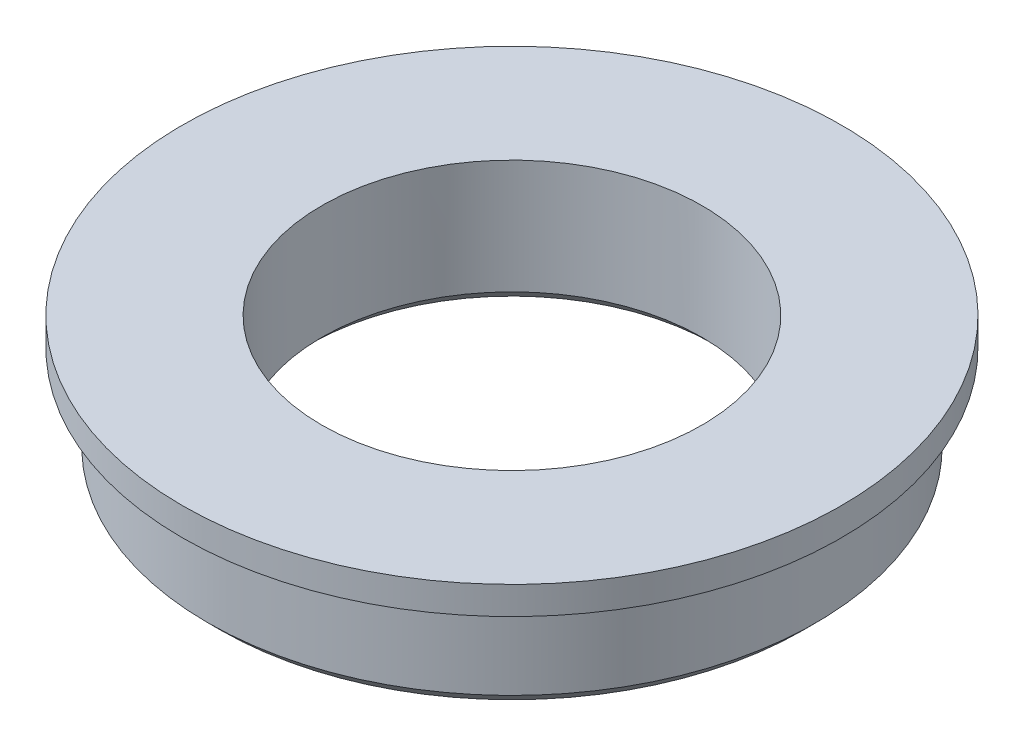
ISO-10303-21;
HEADER;
FILE_DESCRIPTION(('STEP AP214'),'2;1');
FILE_NAME('part.step','',(''),(''),'','','');
FILE_SCHEMA(('AUTOMOTIVE_DESIGN { 1 0 10303 214 1 1 1 1 }'));
ENDSEC;
DATA;
#1=APPLICATION_CONTEXT('core data for automotive mechanical design processes');
#2=APPLICATION_PROTOCOL_DEFINITION('international standard','automotive_design',2000,#1);
#3=PRODUCT_CONTEXT('',#1,'mechanical');
#4=PRODUCT('Part','Part','',(#3));
#5=PRODUCT_RELATED_PRODUCT_CATEGORY('part','',(#4));
#6=PRODUCT_DEFINITION_FORMATION('','',#4);
#7=PRODUCT_DEFINITION_CONTEXT('part definition',#1,'design');
#8=PRODUCT_DEFINITION('design','',#6,#7);
#9=PRODUCT_DEFINITION_SHAPE('','',#8);
#10=(LENGTH_UNIT() NAMED_UNIT(*) SI_UNIT(.MILLI.,.METRE.));
#11=(NAMED_UNIT(*) PLANE_ANGLE_UNIT() SI_UNIT($,.RADIAN.));
#12=(NAMED_UNIT(*) SI_UNIT($,.STERADIAN.) SOLID_ANGLE_UNIT());
#13=UNCERTAINTY_MEASURE_WITH_UNIT(LENGTH_MEASURE(1.E-05),#10,'distance_accuracy_value','');
#14=(GEOMETRIC_REPRESENTATION_CONTEXT(3) GLOBAL_UNCERTAINTY_ASSIGNED_CONTEXT((#13)) GLOBAL_UNIT_ASSIGNED_CONTEXT((#10,
#11,#12)) REPRESENTATION_CONTEXT('',''));
#15=CARTESIAN_POINT('',(0.,0.,0.));
#16=DIRECTION('',(0.,0.,1.));
#17=DIRECTION('',(1.,0.,0.));
#18=AXIS2_PLACEMENT_3D('',#15,#16,#17);
#19=CARTESIAN_POINT('',(0.,22.088288083813,0.));
#20=DIRECTION('',(0.,1.,0.));
#21=DIRECTION('',(0.,0.,1.));
#22=AXIS2_PLACEMENT_3D('',#19,#20,#21);
#23=CYLINDRICAL_SURFACE('',#22,7.5);
#24=CARTESIAN_POINT('',(0.,0.500000000000004,0.));
#25=DIRECTION('',(0.,-1.,0.));
#26=DIRECTION('',(0.,0.,-1.));
#27=AXIS2_PLACEMENT_3D('',#24,#25,#26);
#28=CIRCLE('',#27,7.5);
#29=CARTESIAN_POINT('',(0.,0.500000000000004,-7.5));
#30=VERTEX_POINT('',#29);
#31=EDGE_CURVE('E40',#30,#30,#28,.T.);
#32=ORIENTED_EDGE('',*,*,#31,.T.);
#33=EDGE_LOOP('',(#32));
#34=FACE_BOUND('',#33,.T.);
#35=CARTESIAN_POINT('',(0.,5.,0.));
#36=DIRECTION('',(0.,1.,0.));
#37=DIRECTION('',(0.,0.,1.));
#38=AXIS2_PLACEMENT_3D('',#35,#36,#37);
#39=CIRCLE('',#38,7.5);
#40=CARTESIAN_POINT('',(0.,5.,7.5));
#41=VERTEX_POINT('',#40);
#42=EDGE_CURVE('E62',#41,#41,#39,.T.);
#43=ORIENTED_EDGE('',*,*,#42,.T.);
#44=EDGE_LOOP('',(#43));
#45=FACE_BOUND('',#44,.T.);
#46=ADVANCED_FACE('F33',(#34,#45),#23,.F.);
#47=CARTESIAN_POINT('',(-7.5,0.,0.));
#48=DIRECTION('',(0.,-1.,0.));
#49=DIRECTION('',(0.,0.,-1.));
#50=AXIS2_PLACEMENT_3D('',#47,#48,#49);
#51=PLANE('',#50);
#52=CARTESIAN_POINT('',(0.,0.,0.));
#53=DIRECTION('',(0.,-1.,0.));
#54=DIRECTION('',(0.,0.,-1.));
#55=AXIS2_PLACEMENT_3D('',#52,#53,#54);
#56=CIRCLE('',#55,8.);
#57=CARTESIAN_POINT('',(0.,0.,-8.));
#58=VERTEX_POINT('',#57);
#59=EDGE_CURVE('E44',#58,#58,#56,.F.);
#60=ORIENTED_EDGE('',*,*,#59,.T.);
#61=EDGE_LOOP('',(#60));
#62=FACE_BOUND('',#61,.T.);
#63=CARTESIAN_POINT('',(0.,0.,0.));
#64=DIRECTION('',(0.,-1.,0.));
#65=DIRECTION('',(0.,0.,-1.));
#66=AXIS2_PLACEMENT_3D('',#63,#64,#65);
#67=CIRCLE('',#66,11.5);
#68=CARTESIAN_POINT('',(0.,0.,-11.5));
#69=VERTEX_POINT('',#68);
#70=EDGE_CURVE('E48',#69,#69,#67,.T.);
#71=ORIENTED_EDGE('',*,*,#70,.T.);
#72=EDGE_LOOP('',(#71));
#73=FACE_BOUND('',#72,.T.);
#74=ADVANCED_FACE('F82',(#62,#73),#51,.T.);
#75=CARTESIAN_POINT('',(0.,22.088288083813,0.));
#76=DIRECTION('',(0.,1.,0.));
#77=DIRECTION('',(0.,0.,1.));
#78=AXIS2_PLACEMENT_3D('',#75,#76,#77);
#79=CYLINDRICAL_SURFACE('',#78,12.);
#80=CARTESIAN_POINT('',(0.,0.500000000000004,0.));
#81=DIRECTION('',(0.,-1.,0.));
#82=DIRECTION('',(0.,0.,-1.));
#83=AXIS2_PLACEMENT_3D('',#80,#81,#82);
#84=CIRCLE('',#83,12.);
#85=CARTESIAN_POINT('',(0.,0.500000000000004,-12.));
#86=VERTEX_POINT('',#85);
#87=EDGE_CURVE('E10',#86,#86,#84,.F.);
#88=ORIENTED_EDGE('',*,*,#87,.T.);
#89=EDGE_LOOP('',(#88));
#90=FACE_BOUND('',#89,.T.);
#91=CARTESIAN_POINT('',(0.,3.9,0.));
#92=DIRECTION('',(0.,1.,0.));
#93=DIRECTION('',(0.,0.,1.));
#94=AXIS2_PLACEMENT_3D('',#91,#92,#93);
#95=CIRCLE('',#94,12.);
#96=CARTESIAN_POINT('',(0.,3.9,12.));
#97=VERTEX_POINT('',#96);
#98=EDGE_CURVE('E53',#97,#97,#95,.T.);
#99=ORIENTED_EDGE('',*,*,#98,.F.);
#100=EDGE_LOOP('',(#99));
#101=FACE_BOUND('',#100,.T.);
#102=ADVANCED_FACE('F87',(#90,#101),#79,.T.);
#103=CARTESIAN_POINT('',(-12.,3.9,0.));
#104=DIRECTION('',(0.,-1.,0.));
#105=DIRECTION('',(0.,0.,-1.));
#106=AXIS2_PLACEMENT_3D('',#103,#104,#105);
#107=PLANE('',#106);
#108=ORIENTED_EDGE('',*,*,#98,.T.);
#109=EDGE_LOOP('',(#108));
#110=FACE_BOUND('',#109,.T.);
#111=CARTESIAN_POINT('',(0.,3.9,0.));
#112=DIRECTION('',(0.,1.,0.));
#113=DIRECTION('',(0.,0.,1.));
#114=AXIS2_PLACEMENT_3D('',#111,#112,#113);
#115=CIRCLE('',#114,13.);
#116=CARTESIAN_POINT('',(0.,3.9,13.));
#117=VERTEX_POINT('',#116);
#118=EDGE_CURVE('E56',#117,#117,#115,.T.);
#119=ORIENTED_EDGE('',*,*,#118,.F.);
#120=EDGE_LOOP('',(#119));
#121=FACE_BOUND('',#120,.T.);
#122=ADVANCED_FACE('F78',(#110,#121),#107,.T.);
#123=CARTESIAN_POINT('',(0.,22.088288083813,0.));
#124=DIRECTION('',(0.,1.,0.));
#125=DIRECTION('',(0.,0.,1.));
#126=AXIS2_PLACEMENT_3D('',#123,#124,#125);
#127=CYLINDRICAL_SURFACE('',#126,13.);
#128=ORIENTED_EDGE('',*,*,#118,.T.);
#129=EDGE_LOOP('',(#128));
#130=FACE_BOUND('',#129,.T.);
#131=CARTESIAN_POINT('',(0.,5.,0.));
#132=DIRECTION('',(0.,1.,0.));
#133=DIRECTION('',(0.,0.,1.));
#134=AXIS2_PLACEMENT_3D('',#131,#132,#133);
#135=CIRCLE('',#134,13.);
#136=CARTESIAN_POINT('',(0.,5.,13.));
#137=VERTEX_POINT('',#136);
#138=EDGE_CURVE('E59',#137,#137,#135,.T.);
#139=ORIENTED_EDGE('',*,*,#138,.F.);
#140=EDGE_LOOP('',(#139));
#141=FACE_BOUND('',#140,.T.);
#142=ADVANCED_FACE('F70',(#130,#141),#127,.T.);
#143=CARTESIAN_POINT('',(-13.,5.,0.));
#144=DIRECTION('',(0.,1.,0.));
#145=DIRECTION('',(0.,0.,1.));
#146=AXIS2_PLACEMENT_3D('',#143,#144,#145);
#147=PLANE('',#146);
#148=ORIENTED_EDGE('',*,*,#138,.T.);
#149=EDGE_LOOP('',(#148));
#150=FACE_BOUND('',#149,.T.);
#151=ORIENTED_EDGE('',*,*,#42,.F.);
#152=EDGE_LOOP('',(#151));
#153=FACE_BOUND('',#152,.T.);
#154=ADVANCED_FACE('F67',(#150,#153),#147,.T.);
#155=CARTESIAN_POINT('',(0.,0.,0.));
#156=DIRECTION('',(0.,-1.,0.));
#157=DIRECTION('',(0.,0.,-1.));
#158=AXIS2_PLACEMENT_3D('',#155,#156,#157);
#159=CONICAL_SURFACE('',#158,8.,0.785398163397446);
#160=ORIENTED_EDGE('',*,*,#31,.F.);
#161=EDGE_LOOP('',(#160));
#162=FACE_BOUND('',#161,.T.);
#163=ORIENTED_EDGE('',*,*,#59,.F.);
#164=EDGE_LOOP('',(#163));
#165=FACE_BOUND('',#164,.T.);
#166=ADVANCED_FACE('F69',(#162,#165),#159,.F.);
#167=CARTESIAN_POINT('',(0.,0.500000000000004,0.));
#168=DIRECTION('',(0.,1.,0.));
#169=DIRECTION('',(0.,0.,1.));
#170=AXIS2_PLACEMENT_3D('',#167,#168,#169);
#171=CONICAL_SURFACE('',#170,12.,0.785398163397453);
#172=ORIENTED_EDGE('',*,*,#70,.F.);
#173=EDGE_LOOP('',(#172));
#174=FACE_BOUND('',#173,.T.);
#175=ORIENTED_EDGE('',*,*,#87,.F.);
#176=EDGE_LOOP('',(#175));
#177=FACE_BOUND('',#176,.T.);
#178=ADVANCED_FACE('F35',(#174,#177),#171,.T.);
#179=CLOSED_SHELL('',(#46,#74,#102,#122,#142,#154,#166,#178));
#180=MANIFOLD_SOLID_BREP('B2',#179);
#181=ADVANCED_BREP_SHAPE_REPRESENTATION('',(#18,#180),#14);
#182=SHAPE_DEFINITION_REPRESENTATION(#9,#181);
ENDSEC;
END-ISO-10303-21;
